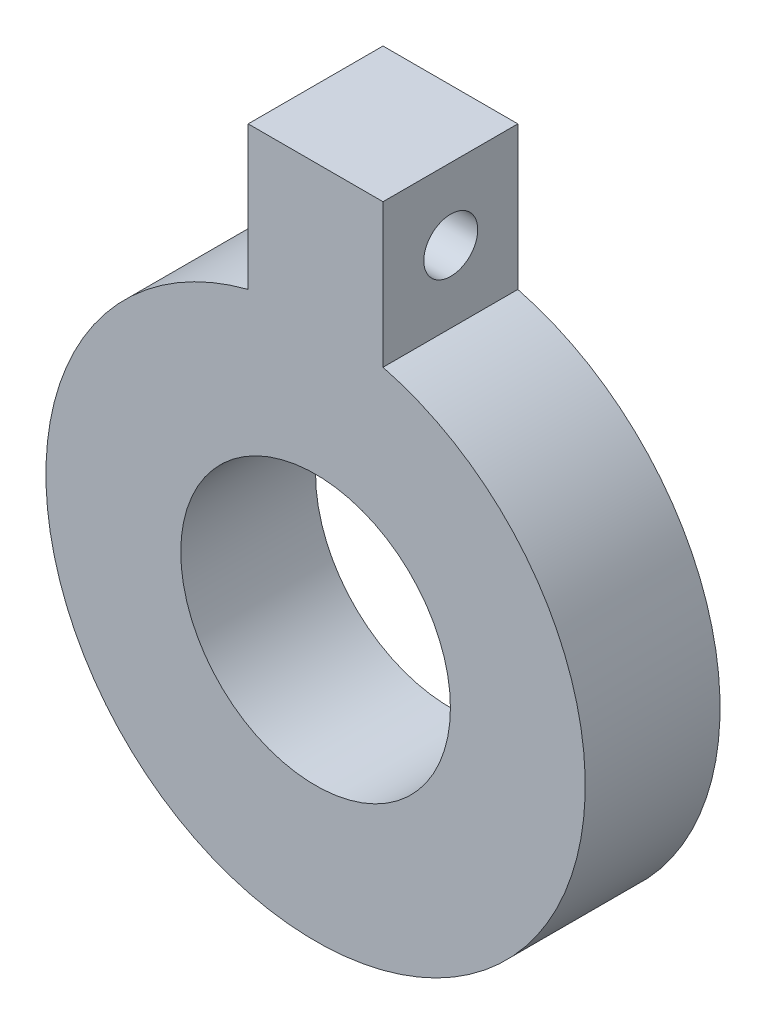
ISO-10303-21;
HEADER;
FILE_DESCRIPTION(('STEP AP214'),'2;1');
FILE_NAME('part.step','',(''),(''),'','','');
FILE_SCHEMA(('AUTOMOTIVE_DESIGN { 1 0 10303 214 1 1 1 1 }'));
ENDSEC;
DATA;
#1=APPLICATION_CONTEXT('core data for automotive mechanical design processes');
#2=APPLICATION_PROTOCOL_DEFINITION('international standard','automotive_design',2000,#1);
#3=PRODUCT_CONTEXT('',#1,'mechanical');
#4=PRODUCT('Part','Part','',(#3));
#5=PRODUCT_RELATED_PRODUCT_CATEGORY('part','',(#4));
#6=PRODUCT_DEFINITION_FORMATION('','',#4);
#7=PRODUCT_DEFINITION_CONTEXT('part definition',#1,'design');
#8=PRODUCT_DEFINITION('design','',#6,#7);
#9=PRODUCT_DEFINITION_SHAPE('','',#8);
#10=(LENGTH_UNIT() NAMED_UNIT(*) SI_UNIT(.MILLI.,.METRE.));
#11=(NAMED_UNIT(*) PLANE_ANGLE_UNIT() SI_UNIT($,.RADIAN.));
#12=(NAMED_UNIT(*) SI_UNIT($,.STERADIAN.) SOLID_ANGLE_UNIT());
#13=UNCERTAINTY_MEASURE_WITH_UNIT(LENGTH_MEASURE(1.E-05),#10,'distance_accuracy_value','');
#14=(GEOMETRIC_REPRESENTATION_CONTEXT(3) GLOBAL_UNCERTAINTY_ASSIGNED_CONTEXT((#13)) GLOBAL_UNIT_ASSIGNED_CONTEXT((#10,
#11,#12)) REPRESENTATION_CONTEXT('',''));
#15=CARTESIAN_POINT('',(0.,0.,0.));
#16=DIRECTION('',(0.,0.,1.));
#17=DIRECTION('',(1.,0.,0.));
#18=AXIS2_PLACEMENT_3D('',#15,#16,#17);
#19=CARTESIAN_POINT('',(0.,0.,5.));
#20=DIRECTION('',(0.,0.,1.));
#21=DIRECTION('',(1.,0.,0.));
#22=AXIS2_PLACEMENT_3D('',#19,#20,#21);
#23=PLANE('',#22);
#24=CARTESIAN_POINT('',(0.,0.,5.));
#25=DIRECTION('',(0.,0.,1.));
#26=DIRECTION('',(1.,0.,0.));
#27=AXIS2_PLACEMENT_3D('',#24,#25,#26);
#28=CIRCLE('',#27,10.);
#29=CARTESIAN_POINT('',(-2.5,9.68245836551854,5.));
#30=VERTEX_POINT('',#29);
#31=CARTESIAN_POINT('',(2.5,9.68245836551854,5.));
#32=VERTEX_POINT('',#31);
#33=EDGE_CURVE('E129',#30,#32,#28,.T.);
#34=ORIENTED_EDGE('',*,*,#33,.T.);
#35=DIRECTION('',(0.,1.,0.));
#36=VECTOR('',#35,1.);
#37=CARTESIAN_POINT('',(2.5,8.,5.));
#38=LINE('',#37,#36);
#39=CARTESIAN_POINT('',(2.5,15.,5.));
#40=VERTEX_POINT('',#39);
#41=EDGE_CURVE('E110',#32,#40,#38,.T.);
#42=ORIENTED_EDGE('',*,*,#41,.T.);
#43=DIRECTION('',(-1.,0.,0.));
#44=VECTOR('',#43,1.);
#45=CARTESIAN_POINT('',(2.5,15.,5.));
#46=LINE('',#45,#44);
#47=CARTESIAN_POINT('',(-2.5,15.,5.));
#48=VERTEX_POINT('',#47);
#49=EDGE_CURVE('E98',#40,#48,#46,.T.);
#50=ORIENTED_EDGE('',*,*,#49,.T.);
#51=DIRECTION('',(0.,-1.,0.));
#52=VECTOR('',#51,1.);
#53=CARTESIAN_POINT('',(-2.5,8.,5.));
#54=LINE('',#53,#52);
#55=EDGE_CURVE('E55',#48,#30,#54,.T.);
#56=ORIENTED_EDGE('',*,*,#55,.T.);
#57=EDGE_LOOP('',(#34,#42,#50,#56));
#58=FACE_BOUND('',#57,.T.);
#59=CARTESIAN_POINT('',(0.,0.,5.));
#60=DIRECTION('',(0.,0.,1.));
#61=DIRECTION('',(1.,0.,0.));
#62=AXIS2_PLACEMENT_3D('',#59,#60,#61);
#63=CIRCLE('',#62,5.);
#64=CARTESIAN_POINT('',(5.,0.,5.));
#65=VERTEX_POINT('',#64);
#66=EDGE_CURVE('E121',#65,#65,#63,.T.);
#67=ORIENTED_EDGE('',*,*,#66,.F.);
#68=EDGE_LOOP('',(#67));
#69=FACE_BOUND('',#68,.T.);
#70=ADVANCED_FACE('F39',(#58,#69),#23,.T.);
#71=CARTESIAN_POINT('',(0.,0.,0.));
#72=DIRECTION('',(0.,0.,1.));
#73=DIRECTION('',(1.,0.,0.));
#74=AXIS2_PLACEMENT_3D('',#71,#72,#73);
#75=PLANE('',#74);
#76=DIRECTION('',(0.,1.,0.));
#77=VECTOR('',#76,1.);
#78=CARTESIAN_POINT('',(2.5,8.,0.));
#79=LINE('',#78,#77);
#80=CARTESIAN_POINT('',(2.5,9.68245836551854,0.));
#81=VERTEX_POINT('',#80);
#82=CARTESIAN_POINT('',(2.5,15.,0.));
#83=VERTEX_POINT('',#82);
#84=EDGE_CURVE('E83',#81,#83,#79,.T.);
#85=ORIENTED_EDGE('',*,*,#84,.F.);
#86=CARTESIAN_POINT('',(0.,0.,0.));
#87=DIRECTION('',(0.,0.,1.));
#88=DIRECTION('',(1.,0.,0.));
#89=AXIS2_PLACEMENT_3D('',#86,#87,#88);
#90=CIRCLE('',#89,10.);
#91=CARTESIAN_POINT('',(-2.5,9.68245836551854,0.));
#92=VERTEX_POINT('',#91);
#93=EDGE_CURVE('E125',#92,#81,#90,.T.);
#94=ORIENTED_EDGE('',*,*,#93,.F.);
#95=DIRECTION('',(0.,-1.,0.));
#96=VECTOR('',#95,1.);
#97=CARTESIAN_POINT('',(-2.5,8.,0.));
#98=LINE('',#97,#96);
#99=CARTESIAN_POINT('',(-2.5,15.,0.));
#100=VERTEX_POINT('',#99);
#101=EDGE_CURVE('E62',#100,#92,#98,.T.);
#102=ORIENTED_EDGE('',*,*,#101,.F.);
#103=DIRECTION('',(-1.,0.,0.));
#104=VECTOR('',#103,1.);
#105=CARTESIAN_POINT('',(2.5,15.,0.));
#106=LINE('',#105,#104);
#107=EDGE_CURVE('E93',#83,#100,#106,.T.);
#108=ORIENTED_EDGE('',*,*,#107,.F.);
#109=EDGE_LOOP('',(#85,#94,#102,#108));
#110=FACE_BOUND('',#109,.T.);
#111=CARTESIAN_POINT('',(0.,0.,0.));
#112=DIRECTION('',(0.,0.,1.));
#113=DIRECTION('',(1.,0.,0.));
#114=AXIS2_PLACEMENT_3D('',#111,#112,#113);
#115=CIRCLE('',#114,5.);
#116=CARTESIAN_POINT('',(5.,0.,0.));
#117=VERTEX_POINT('',#116);
#118=EDGE_CURVE('E119',#117,#117,#115,.T.);
#119=ORIENTED_EDGE('',*,*,#118,.T.);
#120=EDGE_LOOP('',(#119));
#121=FACE_BOUND('',#120,.T.);
#122=ADVANCED_FACE('F102',(#110,#121),#75,.F.);
#123=CARTESIAN_POINT('',(0.,0.,5.));
#124=DIRECTION('',(0.,0.,-1.));
#125=DIRECTION('',(-1.,0.,0.));
#126=AXIS2_PLACEMENT_3D('',#123,#124,#125);
#127=CYLINDRICAL_SURFACE('',#126,10.);
#128=ORIENTED_EDGE('',*,*,#93,.T.);
#129=DIRECTION('',(0.,0.,-1.));
#130=VECTOR('',#129,1.);
#131=CARTESIAN_POINT('',(2.5,9.68245836551854,5.));
#132=LINE('',#131,#130);
#133=EDGE_CURVE('E11',#81,#32,#132,.F.);
#134=ORIENTED_EDGE('',*,*,#133,.T.);
#135=ORIENTED_EDGE('',*,*,#33,.F.);
#136=DIRECTION('',(0.,0.,-1.));
#137=VECTOR('',#136,1.);
#138=CARTESIAN_POINT('',(-2.5,9.68245836551854,5.));
#139=LINE('',#138,#137);
#140=EDGE_CURVE('E48',#30,#92,#139,.T.);
#141=ORIENTED_EDGE('',*,*,#140,.T.);
#142=EDGE_LOOP('',(#128,#134,#135,#141));
#143=FACE_BOUND('',#142,.T.);
#144=ADVANCED_FACE('F41',(#143),#127,.T.);
#145=CARTESIAN_POINT('',(0.,0.,5.));
#146=DIRECTION('',(0.,0.,-1.));
#147=DIRECTION('',(-1.,0.,0.));
#148=AXIS2_PLACEMENT_3D('',#145,#146,#147);
#149=CYLINDRICAL_SURFACE('',#148,5.);
#150=ORIENTED_EDGE('',*,*,#66,.T.);
#151=EDGE_LOOP('',(#150));
#152=FACE_BOUND('',#151,.T.);
#153=ORIENTED_EDGE('',*,*,#118,.F.);
#154=EDGE_LOOP('',(#153));
#155=FACE_BOUND('',#154,.T.);
#156=ADVANCED_FACE('F142',(#152,#155),#149,.F.);
#157=CARTESIAN_POINT('',(2.5,8.,0.));
#158=DIRECTION('',(1.,0.,0.));
#159=DIRECTION('',(0.,1.,0.));
#160=AXIS2_PLACEMENT_3D('',#157,#158,#159);
#161=PLANE('',#160);
#162=CARTESIAN_POINT('',(2.5,12.3458915442409,2.48736407517214));
#163=DIRECTION('',(1.,0.,0.));
#164=DIRECTION('',(0.,1.,0.));
#165=AXIS2_PLACEMENT_3D('',#162,#163,#164);
#166=CIRCLE('',#165,1.);
#167=CARTESIAN_POINT('',(2.5,13.3458915442409,2.48736407517214));
#168=VERTEX_POINT('',#167);
#169=EDGE_CURVE('E113',#168,#168,#166,.T.);
#170=ORIENTED_EDGE('',*,*,#169,.F.);
#171=EDGE_LOOP('',(#170));
#172=FACE_BOUND('',#171,.T.);
#173=ORIENTED_EDGE('',*,*,#133,.F.);
#174=ORIENTED_EDGE('',*,*,#84,.T.);
#175=DIRECTION('',(0.,0.,1.));
#176=VECTOR('',#175,1.);
#177=CARTESIAN_POINT('',(2.5,15.,0.));
#178=LINE('',#177,#176);
#179=EDGE_CURVE('E86',#83,#40,#178,.T.);
#180=ORIENTED_EDGE('',*,*,#179,.T.);
#181=ORIENTED_EDGE('',*,*,#41,.F.);
#182=EDGE_LOOP('',(#173,#174,#180,#181));
#183=FACE_BOUND('',#182,.T.);
#184=ADVANCED_FACE('F85',(#172,#183),#161,.T.);
#185=CARTESIAN_POINT('',(-2.5,8.,0.));
#186=DIRECTION('',(-1.,0.,0.));
#187=DIRECTION('',(0.,0.,1.));
#188=AXIS2_PLACEMENT_3D('',#185,#186,#187);
#189=PLANE('',#188);
#190=CARTESIAN_POINT('',(-2.5,12.3458915442409,2.48736407517214));
#191=DIRECTION('',(-1.,0.,0.));
#192=DIRECTION('',(0.,-1.,0.));
#193=AXIS2_PLACEMENT_3D('',#190,#191,#192);
#194=CIRCLE('',#193,1.);
#195=CARTESIAN_POINT('',(-2.5,11.3458915442409,2.48736407517214));
#196=VERTEX_POINT('',#195);
#197=EDGE_CURVE('E170',#196,#196,#194,.T.);
#198=ORIENTED_EDGE('',*,*,#197,.F.);
#199=EDGE_LOOP('',(#198));
#200=FACE_BOUND('',#199,.T.);
#201=ORIENTED_EDGE('',*,*,#140,.F.);
#202=ORIENTED_EDGE('',*,*,#55,.F.);
#203=DIRECTION('',(0.,0.,1.));
#204=VECTOR('',#203,1.);
#205=CARTESIAN_POINT('',(-2.5,15.,0.));
#206=LINE('',#205,#204);
#207=EDGE_CURVE('E100',#100,#48,#206,.T.);
#208=ORIENTED_EDGE('',*,*,#207,.F.);
#209=ORIENTED_EDGE('',*,*,#101,.T.);
#210=EDGE_LOOP('',(#201,#202,#208,#209));
#211=FACE_BOUND('',#210,.T.);
#212=ADVANCED_FACE('F136',(#200,#211),#189,.T.);
#213=CARTESIAN_POINT('',(2.5,15.,0.));
#214=DIRECTION('',(0.,1.,0.));
#215=DIRECTION('',(0.,0.,1.));
#216=AXIS2_PLACEMENT_3D('',#213,#214,#215);
#217=PLANE('',#216);
#218=ORIENTED_EDGE('',*,*,#49,.F.);
#219=ORIENTED_EDGE('',*,*,#179,.F.);
#220=ORIENTED_EDGE('',*,*,#107,.T.);
#221=ORIENTED_EDGE('',*,*,#207,.T.);
#222=EDGE_LOOP('',(#218,#219,#220,#221));
#223=FACE_BOUND('',#222,.T.);
#224=ADVANCED_FACE('F97',(#223),#217,.T.);
#225=CARTESIAN_POINT('',(7.5,12.3458915442409,2.48736407517214));
#226=DIRECTION('',(-1.,0.,0.));
#227=DIRECTION('',(0.,-1.,0.));
#228=AXIS2_PLACEMENT_3D('',#225,#226,#227);
#229=CYLINDRICAL_SURFACE('',#228,1.);
#230=ORIENTED_EDGE('',*,*,#169,.T.);
#231=EDGE_LOOP('',(#230));
#232=FACE_BOUND('',#231,.T.);
#233=ORIENTED_EDGE('',*,*,#197,.T.);
#234=EDGE_LOOP('',(#233));
#235=FACE_BOUND('',#234,.T.);
#236=ADVANCED_FACE('F157',(#232,#235),#229,.F.);
#237=CLOSED_SHELL('',(#70,#122,#144,#156,#184,#212,#224,#236));
#238=MANIFOLD_SOLID_BREP('B2',#237);
#239=ADVANCED_BREP_SHAPE_REPRESENTATION('',(#18,#238),#14);
#240=SHAPE_DEFINITION_REPRESENTATION(#9,#239);
ENDSEC;
END-ISO-10303-21;
